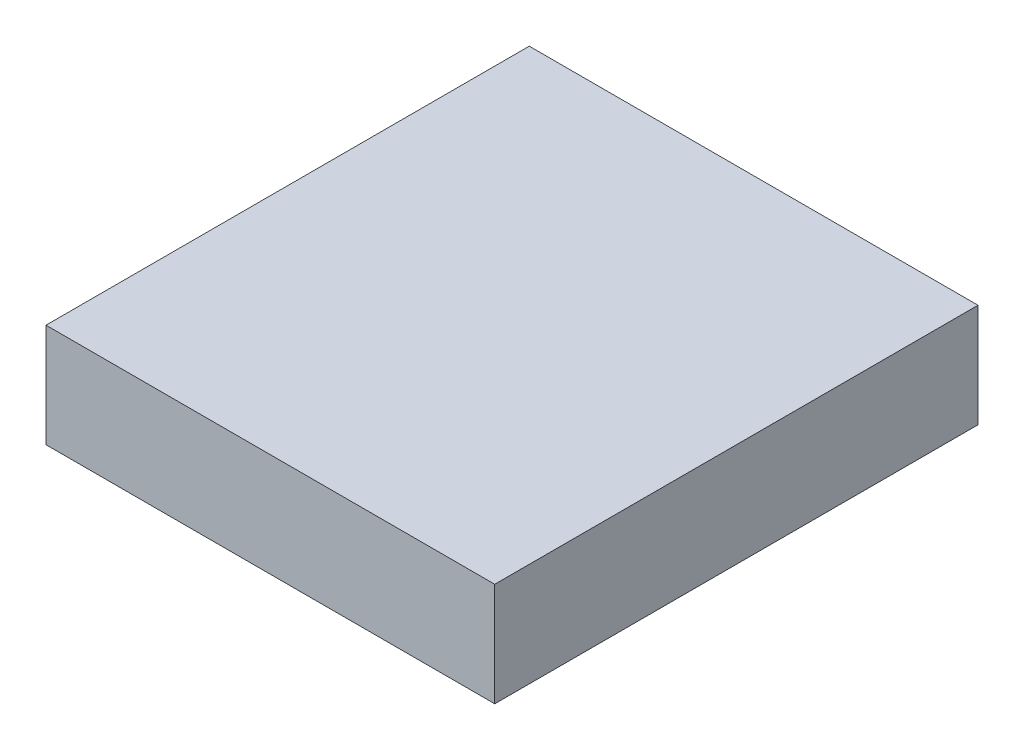
ISO-10303-21;
HEADER;
FILE_DESCRIPTION(('STEP AP214'),'2;1');
FILE_NAME('part.step','',(''),(''),'','','');
FILE_SCHEMA(('AUTOMOTIVE_DESIGN { 1 0 10303 214 1 1 1 1 }'));
ENDSEC;
DATA;
#1=APPLICATION_CONTEXT('core data for automotive mechanical design processes');
#2=APPLICATION_PROTOCOL_DEFINITION('international standard','automotive_design',2000,#1);
#3=PRODUCT_CONTEXT('',#1,'mechanical');
#4=PRODUCT('Part','Part','',(#3));
#5=PRODUCT_RELATED_PRODUCT_CATEGORY('part','',(#4));
#6=PRODUCT_DEFINITION_FORMATION('','',#4);
#7=PRODUCT_DEFINITION_CONTEXT('part definition',#1,'design');
#8=PRODUCT_DEFINITION('design','',#6,#7);
#9=PRODUCT_DEFINITION_SHAPE('','',#8);
#10=(LENGTH_UNIT() NAMED_UNIT(*) SI_UNIT(.MILLI.,.METRE.));
#11=(NAMED_UNIT(*) PLANE_ANGLE_UNIT() SI_UNIT($,.RADIAN.));
#12=(NAMED_UNIT(*) SI_UNIT($,.STERADIAN.) SOLID_ANGLE_UNIT());
#13=UNCERTAINTY_MEASURE_WITH_UNIT(LENGTH_MEASURE(1.E-05),#10,'distance_accuracy_value','');
#14=(GEOMETRIC_REPRESENTATION_CONTEXT(3) GLOBAL_UNCERTAINTY_ASSIGNED_CONTEXT((#13)) GLOBAL_UNIT_ASSIGNED_CONTEXT((#10,
#11,#12)) REPRESENTATION_CONTEXT('',''));
#15=CARTESIAN_POINT('',(0.,0.,0.));
#16=DIRECTION('',(0.,0.,1.));
#17=DIRECTION('',(1.,0.,0.));
#18=AXIS2_PLACEMENT_3D('',#15,#16,#17);
#19=CARTESIAN_POINT('',(41.275,19.05,-44.45));
#20=DIRECTION('',(-1.,0.,0.));
#21=DIRECTION('',(0.,0.,1.));
#22=AXIS2_PLACEMENT_3D('',#19,#20,#21);
#23=PLANE('',#22);
#24=DIRECTION('',(0.,0.,-1.));
#25=VECTOR('',#24,1.);
#26=CARTESIAN_POINT('',(41.275,0.,-44.45));
#27=LINE('',#26,#25);
#28=CARTESIAN_POINT('',(41.275,0.,44.45));
#29=VERTEX_POINT('',#28);
#30=CARTESIAN_POINT('',(41.275,0.,-44.45));
#31=VERTEX_POINT('',#30);
#32=EDGE_CURVE('E96',#29,#31,#27,.T.);
#33=ORIENTED_EDGE('',*,*,#32,.T.);
#34=DIRECTION('',(0.,-1.,0.));
#35=VECTOR('',#34,1.);
#36=CARTESIAN_POINT('',(41.275,19.05,-44.45));
#37=LINE('',#36,#35);
#38=CARTESIAN_POINT('',(41.275,19.05,-44.45));
#39=VERTEX_POINT('',#38);
#40=EDGE_CURVE('E11',#39,#31,#37,.T.);
#41=ORIENTED_EDGE('',*,*,#40,.F.);
#42=DIRECTION('',(0.,0.,-1.));
#43=VECTOR('',#42,1.);
#44=CARTESIAN_POINT('',(41.275,19.05,-44.45));
#45=LINE('',#44,#43);
#46=CARTESIAN_POINT('',(41.275,19.05,44.45));
#47=VERTEX_POINT('',#46);
#48=EDGE_CURVE('E84',#47,#39,#45,.T.);
#49=ORIENTED_EDGE('',*,*,#48,.F.);
#50=DIRECTION('',(0.,-1.,0.));
#51=VECTOR('',#50,1.);
#52=CARTESIAN_POINT('',(41.275,19.05,44.45));
#53=LINE('',#52,#51);
#54=EDGE_CURVE('E92',#47,#29,#53,.T.);
#55=ORIENTED_EDGE('',*,*,#54,.T.);
#56=EDGE_LOOP('',(#33,#41,#49,#55));
#57=FACE_BOUND('',#56,.T.);
#58=ADVANCED_FACE('F33',(#57),#23,.F.);
#59=CARTESIAN_POINT('',(-41.275,19.05,-44.45));
#60=DIRECTION('',(0.,0.,1.));
#61=DIRECTION('',(1.,0.,0.));
#62=AXIS2_PLACEMENT_3D('',#59,#60,#61);
#63=PLANE('',#62);
#64=DIRECTION('',(-1.,0.,0.));
#65=VECTOR('',#64,1.);
#66=CARTESIAN_POINT('',(-41.275,0.,-44.45));
#67=LINE('',#66,#65);
#68=CARTESIAN_POINT('',(-41.275,0.,-44.45));
#69=VERTEX_POINT('',#68);
#70=EDGE_CURVE('E88',#31,#69,#67,.T.);
#71=ORIENTED_EDGE('',*,*,#70,.T.);
#72=DIRECTION('',(0.,-1.,0.));
#73=VECTOR('',#72,1.);
#74=CARTESIAN_POINT('',(-41.275,19.05,-44.45));
#75=LINE('',#74,#73);
#76=CARTESIAN_POINT('',(-41.275,19.05,-44.45));
#77=VERTEX_POINT('',#76);
#78=EDGE_CURVE('E41',#77,#69,#75,.T.);
#79=ORIENTED_EDGE('',*,*,#78,.F.);
#80=DIRECTION('',(-1.,0.,0.));
#81=VECTOR('',#80,1.);
#82=CARTESIAN_POINT('',(-41.275,19.05,-44.45));
#83=LINE('',#82,#81);
#84=EDGE_CURVE('E79',#39,#77,#83,.T.);
#85=ORIENTED_EDGE('',*,*,#84,.F.);
#86=ORIENTED_EDGE('',*,*,#40,.T.);
#87=EDGE_LOOP('',(#71,#79,#85,#86));
#88=FACE_BOUND('',#87,.T.);
#89=ADVANCED_FACE('F87',(#88),#63,.F.);
#90=CARTESIAN_POINT('',(-41.275,19.05,-44.45));
#91=DIRECTION('',(1.,0.,0.));
#92=DIRECTION('',(0.,0.,-1.));
#93=AXIS2_PLACEMENT_3D('',#90,#91,#92);
#94=PLANE('',#93);
#95=DIRECTION('',(0.,0.,1.));
#96=VECTOR('',#95,1.);
#97=CARTESIAN_POINT('',(-41.275,0.,-44.45));
#98=LINE('',#97,#96);
#99=CARTESIAN_POINT('',(-41.275,0.,44.45));
#100=VERTEX_POINT('',#99);
#101=EDGE_CURVE('E66',#69,#100,#98,.T.);
#102=ORIENTED_EDGE('',*,*,#101,.T.);
#103=DIRECTION('',(0.,-1.,0.));
#104=VECTOR('',#103,1.);
#105=CARTESIAN_POINT('',(-41.275,19.05,44.45));
#106=LINE('',#105,#104);
#107=CARTESIAN_POINT('',(-41.275,19.05,44.45));
#108=VERTEX_POINT('',#107);
#109=EDGE_CURVE('E89',#108,#100,#106,.T.);
#110=ORIENTED_EDGE('',*,*,#109,.F.);
#111=DIRECTION('',(0.,0.,1.));
#112=VECTOR('',#111,1.);
#113=CARTESIAN_POINT('',(-41.275,19.05,-44.45));
#114=LINE('',#113,#112);
#115=EDGE_CURVE('E82',#77,#108,#114,.T.);
#116=ORIENTED_EDGE('',*,*,#115,.F.);
#117=ORIENTED_EDGE('',*,*,#78,.T.);
#118=EDGE_LOOP('',(#102,#110,#116,#117));
#119=FACE_BOUND('',#118,.T.);
#120=ADVANCED_FACE('F90',(#119),#94,.F.);
#121=CARTESIAN_POINT('',(-41.275,19.05,44.45));
#122=DIRECTION('',(0.,0.,-1.));
#123=DIRECTION('',(-1.,0.,0.));
#124=AXIS2_PLACEMENT_3D('',#121,#122,#123);
#125=PLANE('',#124);
#126=DIRECTION('',(1.,0.,0.));
#127=VECTOR('',#126,1.);
#128=CARTESIAN_POINT('',(-41.275,0.,44.45));
#129=LINE('',#128,#127);
#130=EDGE_CURVE('E72',#100,#29,#129,.T.);
#131=ORIENTED_EDGE('',*,*,#130,.T.);
#132=ORIENTED_EDGE('',*,*,#54,.F.);
#133=DIRECTION('',(1.,0.,0.));
#134=VECTOR('',#133,1.);
#135=CARTESIAN_POINT('',(-41.275,19.05,44.45));
#136=LINE('',#135,#134);
#137=EDGE_CURVE('E49',#108,#47,#136,.T.);
#138=ORIENTED_EDGE('',*,*,#137,.F.);
#139=ORIENTED_EDGE('',*,*,#109,.T.);
#140=EDGE_LOOP('',(#131,#132,#138,#139));
#141=FACE_BOUND('',#140,.T.);
#142=ADVANCED_FACE('F103',(#141),#125,.F.);
#143=CARTESIAN_POINT('',(0.,19.05,0.));
#144=DIRECTION('',(0.,1.,0.));
#145=DIRECTION('',(0.,0.,1.));
#146=AXIS2_PLACEMENT_3D('',#143,#144,#145);
#147=PLANE('',#146);
#148=ORIENTED_EDGE('',*,*,#48,.T.);
#149=ORIENTED_EDGE('',*,*,#84,.T.);
#150=ORIENTED_EDGE('',*,*,#115,.T.);
#151=ORIENTED_EDGE('',*,*,#137,.T.);
#152=EDGE_LOOP('',(#148,#149,#150,#151));
#153=FACE_BOUND('',#152,.T.);
#154=ADVANCED_FACE('F80',(#153),#147,.T.);
#155=CARTESIAN_POINT('',(0.,0.,0.));
#156=DIRECTION('',(0.,1.,0.));
#157=DIRECTION('',(0.,0.,1.));
#158=AXIS2_PLACEMENT_3D('',#155,#156,#157);
#159=PLANE('',#158);
#160=ORIENTED_EDGE('',*,*,#32,.F.);
#161=ORIENTED_EDGE('',*,*,#130,.F.);
#162=ORIENTED_EDGE('',*,*,#101,.F.);
#163=ORIENTED_EDGE('',*,*,#70,.F.);
#164=EDGE_LOOP('',(#160,#161,#162,#163));
#165=FACE_BOUND('',#164,.T.);
#166=ADVANCED_FACE('F106',(#165),#159,.F.);
#167=CLOSED_SHELL('',(#58,#89,#120,#142,#154,#166));
#168=MANIFOLD_SOLID_BREP('B2',#167);
#169=ADVANCED_BREP_SHAPE_REPRESENTATION('',(#18,#168),#14);
#170=SHAPE_DEFINITION_REPRESENTATION(#9,#169);
ENDSEC;
END-ISO-10303-21;
